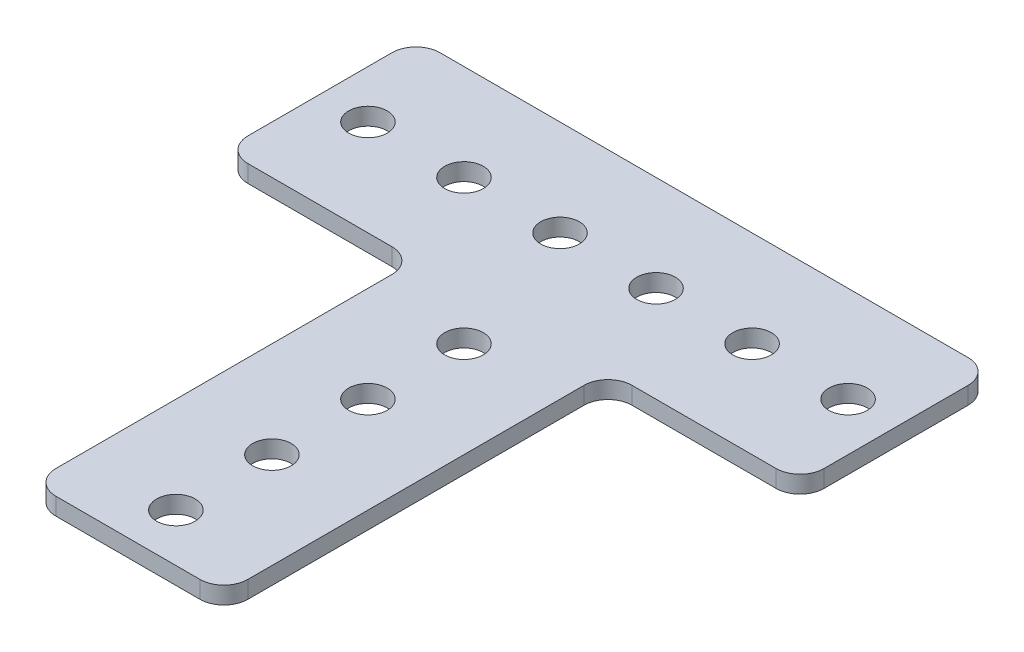
ISO-10303-21;
HEADER;
FILE_DESCRIPTION(('STEP AP214'),'2;1');
FILE_NAME('part.step','',(''),(''),'','','');
FILE_SCHEMA(('AUTOMOTIVE_DESIGN { 1 0 10303 214 1 1 1 1 }'));
ENDSEC;
DATA;
#1=APPLICATION_CONTEXT('core data for automotive mechanical design processes');
#2=APPLICATION_PROTOCOL_DEFINITION('international standard','automotive_design',2000,#1);
#3=PRODUCT_CONTEXT('',#1,'mechanical');
#4=PRODUCT('Part','Part','',(#3));
#5=PRODUCT_RELATED_PRODUCT_CATEGORY('part','',(#4));
#6=PRODUCT_DEFINITION_FORMATION('','',#4);
#7=PRODUCT_DEFINITION_CONTEXT('part definition',#1,'design');
#8=PRODUCT_DEFINITION('design','',#6,#7);
#9=PRODUCT_DEFINITION_SHAPE('','',#8);
#10=(LENGTH_UNIT() NAMED_UNIT(*) SI_UNIT(.MILLI.,.METRE.));
#11=(NAMED_UNIT(*) PLANE_ANGLE_UNIT() SI_UNIT($,.RADIAN.));
#12=(NAMED_UNIT(*) SI_UNIT($,.STERADIAN.) SOLID_ANGLE_UNIT());
#13=UNCERTAINTY_MEASURE_WITH_UNIT(LENGTH_MEASURE(1.E-05),#10,'distance_accuracy_value','');
#14=(GEOMETRIC_REPRESENTATION_CONTEXT(3) GLOBAL_UNCERTAINTY_ASSIGNED_CONTEXT((#13)) GLOBAL_UNIT_ASSIGNED_CONTEXT((#10,
#11,#12)) REPRESENTATION_CONTEXT('',''));
#15=CARTESIAN_POINT('',(0.,0.,0.));
#16=DIRECTION('',(0.,0.,1.));
#17=DIRECTION('',(1.,0.,0.));
#18=AXIS2_PLACEMENT_3D('',#15,#16,#17);
#19=CARTESIAN_POINT('',(38.1,1.143,-12.7));
#20=DIRECTION('',(-1.,0.,0.));
#21=DIRECTION('',(0.,0.,1.));
#22=AXIS2_PLACEMENT_3D('',#19,#20,#21);
#23=PLANE('',#22);
#24=DIRECTION('',(0.,0.,-1.));
#25=VECTOR('',#24,1.);
#26=CARTESIAN_POINT('',(38.1,1.143,-12.7));
#27=LINE('',#26,#25);
#28=CARTESIAN_POINT('',(38.1,1.143,9.525));
#29=VERTEX_POINT('',#28);
#30=CARTESIAN_POINT('',(38.1,1.143,-9.525));
#31=VERTEX_POINT('',#30);
#32=EDGE_CURVE('E166',#29,#31,#27,.T.);
#33=ORIENTED_EDGE('',*,*,#32,.F.);
#34=DIRECTION('',(0.,-1.,0.));
#35=VECTOR('',#34,1.);
#36=CARTESIAN_POINT('',(38.1,1.143,9.525));
#37=LINE('',#36,#35);
#38=CARTESIAN_POINT('',(38.1,-1.143,9.525));
#39=VERTEX_POINT('',#38);
#40=EDGE_CURVE('E151',#29,#39,#37,.T.);
#41=ORIENTED_EDGE('',*,*,#40,.T.);
#42=DIRECTION('',(0.,0.,-1.));
#43=VECTOR('',#42,1.);
#44=CARTESIAN_POINT('',(38.1,-1.143,-12.7));
#45=LINE('',#44,#43);
#46=CARTESIAN_POINT('',(38.1,-1.143,-9.525));
#47=VERTEX_POINT('',#46);
#48=EDGE_CURVE('E163',#39,#47,#45,.T.);
#49=ORIENTED_EDGE('',*,*,#48,.T.);
#50=DIRECTION('',(0.,-1.,0.));
#51=VECTOR('',#50,1.);
#52=CARTESIAN_POINT('',(38.1,1.143,-9.525));
#53=LINE('',#52,#51);
#54=EDGE_CURVE('E168',#47,#31,#53,.F.);
#55=ORIENTED_EDGE('',*,*,#54,.T.);
#56=EDGE_LOOP('',(#33,#41,#49,#55));
#57=FACE_BOUND('',#56,.T.);
#58=ADVANCED_FACE('F33',(#57),#23,.F.);
#59=CARTESIAN_POINT('',(-38.1,1.143,-12.7));
#60=DIRECTION('',(0.,0.,1.));
#61=DIRECTION('',(1.,0.,0.));
#62=AXIS2_PLACEMENT_3D('',#59,#60,#61);
#63=PLANE('',#62);
#64=DIRECTION('',(-1.,0.,0.));
#65=VECTOR('',#64,1.);
#66=CARTESIAN_POINT('',(-38.1,-1.143,-12.7));
#67=LINE('',#66,#65);
#68=CARTESIAN_POINT('',(34.925,-1.143,-12.7));
#69=VERTEX_POINT('',#68);
#70=CARTESIAN_POINT('',(-34.925,-1.143,-12.7));
#71=VERTEX_POINT('',#70);
#72=EDGE_CURVE('E173',#69,#71,#67,.T.);
#73=ORIENTED_EDGE('',*,*,#72,.T.);
#74=DIRECTION('',(0.,-1.,0.));
#75=VECTOR('',#74,1.);
#76=CARTESIAN_POINT('',(-34.925,1.143,-12.7));
#77=LINE('',#76,#75);
#78=CARTESIAN_POINT('',(-34.925,1.143,-12.7));
#79=VERTEX_POINT('',#78);
#80=EDGE_CURVE('E245',#71,#79,#77,.F.);
#81=ORIENTED_EDGE('',*,*,#80,.T.);
#82=DIRECTION('',(-1.,0.,0.));
#83=VECTOR('',#82,1.);
#84=CARTESIAN_POINT('',(-38.1,1.143,-12.7));
#85=LINE('',#84,#83);
#86=CARTESIAN_POINT('',(34.925,1.143,-12.7));
#87=VERTEX_POINT('',#86);
#88=EDGE_CURVE('E346',#87,#79,#85,.T.);
#89=ORIENTED_EDGE('',*,*,#88,.F.);
#90=DIRECTION('',(0.,-1.,0.));
#91=VECTOR('',#90,1.);
#92=CARTESIAN_POINT('',(34.925,1.143,-12.7));
#93=LINE('',#92,#91);
#94=EDGE_CURVE('E242',#87,#69,#93,.T.);
#95=ORIENTED_EDGE('',*,*,#94,.T.);
#96=EDGE_LOOP('',(#73,#81,#89,#95));
#97=FACE_BOUND('',#96,.T.);
#98=ADVANCED_FACE('F313',(#97),#63,.F.);
#99=CARTESIAN_POINT('',(-38.1,1.143,-12.7));
#100=DIRECTION('',(1.,0.,0.));
#101=DIRECTION('',(0.,0.,-1.));
#102=AXIS2_PLACEMENT_3D('',#99,#100,#101);
#103=PLANE('',#102);
#104=DIRECTION('',(0.,0.,1.));
#105=VECTOR('',#104,1.);
#106=CARTESIAN_POINT('',(-38.1,-1.143,-12.7));
#107=LINE('',#106,#105);
#108=CARTESIAN_POINT('',(-38.1,-1.143,-9.525));
#109=VERTEX_POINT('',#108);
#110=CARTESIAN_POINT('',(-38.1,-1.143,9.525));
#111=VERTEX_POINT('',#110);
#112=EDGE_CURVE('E177',#109,#111,#107,.T.);
#113=ORIENTED_EDGE('',*,*,#112,.T.);
#114=DIRECTION('',(0.,-1.,0.));
#115=VECTOR('',#114,1.);
#116=CARTESIAN_POINT('',(-38.1,1.143,9.525));
#117=LINE('',#116,#115);
#118=CARTESIAN_POINT('',(-38.1,1.143,9.525));
#119=VERTEX_POINT('',#118);
#120=EDGE_CURVE('E240',#111,#119,#117,.F.);
#121=ORIENTED_EDGE('',*,*,#120,.T.);
#122=DIRECTION('',(0.,0.,1.));
#123=VECTOR('',#122,1.);
#124=CARTESIAN_POINT('',(-38.1,1.143,-12.7));
#125=LINE('',#124,#123);
#126=CARTESIAN_POINT('',(-38.1,1.143,-9.525));
#127=VERTEX_POINT('',#126);
#128=EDGE_CURVE('E281',#127,#119,#125,.T.);
#129=ORIENTED_EDGE('',*,*,#128,.F.);
#130=DIRECTION('',(0.,-1.,0.));
#131=VECTOR('',#130,1.);
#132=CARTESIAN_POINT('',(-38.1,1.143,-9.525));
#133=LINE('',#132,#131);
#134=EDGE_CURVE('E237',#127,#109,#133,.T.);
#135=ORIENTED_EDGE('',*,*,#134,.T.);
#136=EDGE_LOOP('',(#113,#121,#129,#135));
#137=FACE_BOUND('',#136,.T.);
#138=ADVANCED_FACE('F318',(#137),#103,.F.);
#139=CARTESIAN_POINT('',(-38.1,1.143,12.7));
#140=DIRECTION('',(0.,0.,-1.));
#141=DIRECTION('',(-1.,0.,0.));
#142=AXIS2_PLACEMENT_3D('',#139,#140,#141);
#143=PLANE('',#142);
#144=DIRECTION('',(1.,0.,0.));
#145=VECTOR('',#144,1.);
#146=CARTESIAN_POINT('',(-38.1,-1.143,12.7));
#147=LINE('',#146,#145);
#148=CARTESIAN_POINT('',(-34.925,-1.143,12.7));
#149=VERTEX_POINT('',#148);
#150=CARTESIAN_POINT('',(-15.875,-1.143,12.7));
#151=VERTEX_POINT('',#150);
#152=EDGE_CURVE('E188',#149,#151,#147,.T.);
#153=ORIENTED_EDGE('',*,*,#152,.T.);
#154=DIRECTION('',(0.,-1.,0.));
#155=VECTOR('',#154,1.);
#156=CARTESIAN_POINT('',(-15.875,1.143,12.7));
#157=LINE('',#156,#155);
#158=CARTESIAN_POINT('',(-15.875,1.143,12.7));
#159=VERTEX_POINT('',#158);
#160=EDGE_CURVE('E235',#151,#159,#157,.F.);
#161=ORIENTED_EDGE('',*,*,#160,.T.);
#162=DIRECTION('',(1.,0.,0.));
#163=VECTOR('',#162,1.);
#164=CARTESIAN_POINT('',(-38.1,1.143,12.7));
#165=LINE('',#164,#163);
#166=CARTESIAN_POINT('',(-34.925,1.143,12.7));
#167=VERTEX_POINT('',#166);
#168=EDGE_CURVE('E273',#167,#159,#165,.T.);
#169=ORIENTED_EDGE('',*,*,#168,.F.);
#170=DIRECTION('',(0.,-1.,0.));
#171=VECTOR('',#170,1.);
#172=CARTESIAN_POINT('',(-34.925,1.143,12.7));
#173=LINE('',#172,#171);
#174=EDGE_CURVE('E232',#167,#149,#173,.T.);
#175=ORIENTED_EDGE('',*,*,#174,.T.);
#176=EDGE_LOOP('',(#153,#161,#169,#175));
#177=FACE_BOUND('',#176,.T.);
#178=ADVANCED_FACE('F261',(#177),#143,.F.);
#179=CARTESIAN_POINT('',(-12.7,1.143,12.7));
#180=DIRECTION('',(1.,0.,0.));
#181=DIRECTION('',(0.,0.,-1.));
#182=AXIS2_PLACEMENT_3D('',#179,#180,#181);
#183=PLANE('',#182);
#184=DIRECTION('',(0.,0.,1.));
#185=VECTOR('',#184,1.);
#186=CARTESIAN_POINT('',(-12.7,1.143,12.7));
#187=LINE('',#186,#185);
#188=CARTESIAN_POINT('',(-12.7,1.143,15.875));
#189=VERTEX_POINT('',#188);
#190=CARTESIAN_POINT('',(-12.7,1.143,60.325));
#191=VERTEX_POINT('',#190);
#192=EDGE_CURVE('E271',#189,#191,#187,.T.);
#193=ORIENTED_EDGE('',*,*,#192,.F.);
#194=DIRECTION('',(0.,-1.,0.));
#195=VECTOR('',#194,1.);
#196=CARTESIAN_POINT('',(-12.7,-1.143,15.875));
#197=LINE('',#196,#195);
#198=CARTESIAN_POINT('',(-12.7,-1.143,15.875));
#199=VERTEX_POINT('',#198);
#200=EDGE_CURVE('E229',#189,#199,#197,.T.);
#201=ORIENTED_EDGE('',*,*,#200,.T.);
#202=DIRECTION('',(0.,0.,1.));
#203=VECTOR('',#202,1.);
#204=CARTESIAN_POINT('',(-12.7,-1.143,12.7));
#205=LINE('',#204,#203);
#206=CARTESIAN_POINT('',(-12.7,-1.143,60.325));
#207=VERTEX_POINT('',#206);
#208=EDGE_CURVE('E191',#199,#207,#205,.T.);
#209=ORIENTED_EDGE('',*,*,#208,.T.);
#210=DIRECTION('',(0.,-1.,0.));
#211=VECTOR('',#210,1.);
#212=CARTESIAN_POINT('',(-12.7,1.143,60.325));
#213=LINE('',#212,#211);
#214=EDGE_CURVE('E227',#207,#191,#213,.F.);
#215=ORIENTED_EDGE('',*,*,#214,.T.);
#216=EDGE_LOOP('',(#193,#201,#209,#215));
#217=FACE_BOUND('',#216,.T.);
#218=ADVANCED_FACE('F275',(#217),#183,.F.);
#219=CARTESIAN_POINT('',(-12.7,1.143,63.5));
#220=DIRECTION('',(0.,0.,-1.));
#221=DIRECTION('',(-1.,0.,0.));
#222=AXIS2_PLACEMENT_3D('',#219,#220,#221);
#223=PLANE('',#222);
#224=DIRECTION('',(1.,0.,0.));
#225=VECTOR('',#224,1.);
#226=CARTESIAN_POINT('',(-12.7,1.143,63.5));
#227=LINE('',#226,#225);
#228=CARTESIAN_POINT('',(-9.525,1.143,63.5));
#229=VERTEX_POINT('',#228);
#230=CARTESIAN_POINT('',(9.525,1.143,63.5));
#231=VERTEX_POINT('',#230);
#232=EDGE_CURVE('E277',#229,#231,#227,.T.);
#233=ORIENTED_EDGE('',*,*,#232,.F.);
#234=DIRECTION('',(0.,-1.,0.));
#235=VECTOR('',#234,1.);
#236=CARTESIAN_POINT('',(-9.525,1.143,63.5));
#237=LINE('',#236,#235);
#238=CARTESIAN_POINT('',(-9.525,-1.143,63.5));
#239=VERTEX_POINT('',#238);
#240=EDGE_CURVE('E249',#229,#239,#237,.T.);
#241=ORIENTED_EDGE('',*,*,#240,.T.);
#242=DIRECTION('',(1.,0.,0.));
#243=VECTOR('',#242,1.);
#244=CARTESIAN_POINT('',(-12.7,-1.143,63.5));
#245=LINE('',#244,#243);
#246=CARTESIAN_POINT('',(9.525,-1.143,63.5));
#247=VERTEX_POINT('',#246);
#248=EDGE_CURVE('E194',#239,#247,#245,.T.);
#249=ORIENTED_EDGE('',*,*,#248,.T.);
#250=DIRECTION('',(0.,-1.,0.));
#251=VECTOR('',#250,1.);
#252=CARTESIAN_POINT('',(9.525,1.143,63.5));
#253=LINE('',#252,#251);
#254=EDGE_CURVE('E247',#247,#231,#253,.F.);
#255=ORIENTED_EDGE('',*,*,#254,.T.);
#256=EDGE_LOOP('',(#233,#241,#249,#255));
#257=FACE_BOUND('',#256,.T.);
#258=ADVANCED_FACE('F299',(#257),#223,.F.);
#259=CARTESIAN_POINT('',(12.7,1.143,12.7));
#260=DIRECTION('',(-1.,0.,0.));
#261=DIRECTION('',(0.,0.,1.));
#262=AXIS2_PLACEMENT_3D('',#259,#260,#261);
#263=PLANE('',#262);
#264=DIRECTION('',(0.,0.,-1.));
#265=VECTOR('',#264,1.);
#266=CARTESIAN_POINT('',(12.7,-1.143,12.7));
#267=LINE('',#266,#265);
#268=CARTESIAN_POINT('',(12.7,-1.143,60.325));
#269=VERTEX_POINT('',#268);
#270=CARTESIAN_POINT('',(12.7,-1.143,15.875));
#271=VERTEX_POINT('',#270);
#272=EDGE_CURVE('E197',#269,#271,#267,.T.);
#273=ORIENTED_EDGE('',*,*,#272,.T.);
#274=DIRECTION('',(0.,-1.,0.));
#275=VECTOR('',#274,1.);
#276=CARTESIAN_POINT('',(12.7,1.143,15.875));
#277=LINE('',#276,#275);
#278=CARTESIAN_POINT('',(12.7,1.143,15.875));
#279=VERTEX_POINT('',#278);
#280=EDGE_CURVE('E48',#271,#279,#277,.F.);
#281=ORIENTED_EDGE('',*,*,#280,.T.);
#282=DIRECTION('',(0.,0.,-1.));
#283=VECTOR('',#282,1.);
#284=CARTESIAN_POINT('',(12.7,1.143,12.7));
#285=LINE('',#284,#283);
#286=CARTESIAN_POINT('',(12.7,1.143,60.325));
#287=VERTEX_POINT('',#286);
#288=EDGE_CURVE('E279',#287,#279,#285,.T.);
#289=ORIENTED_EDGE('',*,*,#288,.F.);
#290=DIRECTION('',(0.,-1.,0.));
#291=VECTOR('',#290,1.);
#292=CARTESIAN_POINT('',(12.7,1.143,60.325));
#293=LINE('',#292,#291);
#294=EDGE_CURVE('E223',#287,#269,#293,.T.);
#295=ORIENTED_EDGE('',*,*,#294,.T.);
#296=EDGE_LOOP('',(#273,#281,#289,#295));
#297=FACE_BOUND('',#296,.T.);
#298=ADVANCED_FACE('F292',(#297),#263,.F.);
#299=CARTESIAN_POINT('',(12.7,1.143,12.7));
#300=DIRECTION('',(0.,0.,-1.));
#301=DIRECTION('',(-1.,0.,0.));
#302=AXIS2_PLACEMENT_3D('',#299,#300,#301);
#303=PLANE('',#302);
#304=DIRECTION('',(1.,0.,0.));
#305=VECTOR('',#304,1.);
#306=CARTESIAN_POINT('',(12.7,-1.143,12.7));
#307=LINE('',#306,#305);
#308=CARTESIAN_POINT('',(15.875,-1.143,12.7));
#309=VERTEX_POINT('',#308);
#310=CARTESIAN_POINT('',(34.925,-1.143,12.7));
#311=VERTEX_POINT('',#310);
#312=EDGE_CURVE('E199',#309,#311,#307,.T.);
#313=ORIENTED_EDGE('',*,*,#312,.T.);
#314=DIRECTION('',(0.,-1.,0.));
#315=VECTOR('',#314,1.);
#316=CARTESIAN_POINT('',(34.925,1.143,12.7));
#317=LINE('',#316,#315);
#318=CARTESIAN_POINT('',(34.925,1.143,12.7));
#319=VERTEX_POINT('',#318);
#320=EDGE_CURVE('E152',#311,#319,#317,.F.);
#321=ORIENTED_EDGE('',*,*,#320,.T.);
#322=DIRECTION('',(1.,0.,0.));
#323=VECTOR('',#322,1.);
#324=CARTESIAN_POINT('',(12.7,1.143,12.7));
#325=LINE('',#324,#323);
#326=CARTESIAN_POINT('',(15.875,1.143,12.7));
#327=VERTEX_POINT('',#326);
#328=EDGE_CURVE('E183',#327,#319,#325,.T.);
#329=ORIENTED_EDGE('',*,*,#328,.F.);
#330=DIRECTION('',(0.,-1.,0.));
#331=VECTOR('',#330,1.);
#332=CARTESIAN_POINT('',(15.875,-1.143,12.7));
#333=LINE('',#332,#331);
#334=EDGE_CURVE('E157',#327,#309,#333,.T.);
#335=ORIENTED_EDGE('',*,*,#334,.T.);
#336=EDGE_LOOP('',(#313,#321,#329,#335));
#337=FACE_BOUND('',#336,.T.);
#338=ADVANCED_FACE('F288',(#337),#303,.F.);
#339=CARTESIAN_POINT('',(0.,1.143,0.));
#340=DIRECTION('',(0.,1.,0.));
#341=DIRECTION('',(0.,0.,1.));
#342=AXIS2_PLACEMENT_3D('',#339,#340,#341);
#343=PLANE('',#342);
#344=CARTESIAN_POINT('',(-1.26086545106016E-13,1.143,19.05));
#345=DIRECTION('',(0.,1.,0.));
#346=DIRECTION('',(0.,0.,1.));
#347=AXIS2_PLACEMENT_3D('',#344,#345,#346);
#348=CIRCLE('',#347,2.5527);
#349=CARTESIAN_POINT('',(-1.26086545106016E-13,1.143,21.6027));
#350=VERTEX_POINT('',#349);
#351=EDGE_CURVE('E404',#350,#350,#348,.T.);
#352=ORIENTED_EDGE('',*,*,#351,.F.);
#353=EDGE_LOOP('',(#352));
#354=FACE_BOUND('',#353,.T.);
#355=CARTESIAN_POINT('',(0.,1.143,31.75));
#356=DIRECTION('',(0.,1.,0.));
#357=DIRECTION('',(0.,0.,1.));
#358=AXIS2_PLACEMENT_3D('',#355,#356,#357);
#359=CIRCLE('',#358,2.5527);
#360=CARTESIAN_POINT('',(0.,1.143,34.3027));
#361=VERTEX_POINT('',#360);
#362=EDGE_CURVE('E398',#361,#361,#359,.T.);
#363=ORIENTED_EDGE('',*,*,#362,.F.);
#364=EDGE_LOOP('',(#363));
#365=FACE_BOUND('',#364,.T.);
#366=CARTESIAN_POINT('',(31.75,1.143,0.));
#367=DIRECTION('',(0.,1.,0.));
#368=DIRECTION('',(0.,0.,1.));
#369=AXIS2_PLACEMENT_3D('',#366,#367,#368);
#370=CIRCLE('',#369,2.5527);
#371=CARTESIAN_POINT('',(31.75,1.143,2.5527));
#372=VERTEX_POINT('',#371);
#373=EDGE_CURVE('E392',#372,#372,#370,.T.);
#374=ORIENTED_EDGE('',*,*,#373,.F.);
#375=EDGE_LOOP('',(#374));
#376=FACE_BOUND('',#375,.T.);
#377=CARTESIAN_POINT('',(19.05,1.143,0.));
#378=DIRECTION('',(0.,1.,0.));
#379=DIRECTION('',(0.,0.,1.));
#380=AXIS2_PLACEMENT_3D('',#377,#378,#379);
#381=CIRCLE('',#380,2.5527);
#382=CARTESIAN_POINT('',(19.05,1.143,2.5527));
#383=VERTEX_POINT('',#382);
#384=EDGE_CURVE('E386',#383,#383,#381,.T.);
#385=ORIENTED_EDGE('',*,*,#384,.F.);
#386=EDGE_LOOP('',(#385));
#387=FACE_BOUND('',#386,.T.);
#388=CARTESIAN_POINT('',(6.35,1.143,0.));
#389=DIRECTION('',(0.,1.,0.));
#390=DIRECTION('',(0.,0.,1.));
#391=AXIS2_PLACEMENT_3D('',#388,#389,#390);
#392=CIRCLE('',#391,2.5527);
#393=CARTESIAN_POINT('',(6.35,1.143,2.5527));
#394=VERTEX_POINT('',#393);
#395=EDGE_CURVE('E380',#394,#394,#392,.T.);
#396=ORIENTED_EDGE('',*,*,#395,.F.);
#397=EDGE_LOOP('',(#396));
#398=FACE_BOUND('',#397,.T.);
#399=CARTESIAN_POINT('',(-6.34999999999999,1.143,0.));
#400=DIRECTION('',(0.,1.,0.));
#401=DIRECTION('',(0.,0.,1.));
#402=AXIS2_PLACEMENT_3D('',#399,#400,#401);
#403=CIRCLE('',#402,2.5527);
#404=CARTESIAN_POINT('',(-6.34999999999999,1.143,2.5527));
#405=VERTEX_POINT('',#404);
#406=EDGE_CURVE('E374',#405,#405,#403,.T.);
#407=ORIENTED_EDGE('',*,*,#406,.F.);
#408=EDGE_LOOP('',(#407));
#409=FACE_BOUND('',#408,.T.);
#410=CARTESIAN_POINT('',(-19.05,1.143,0.));
#411=DIRECTION('',(0.,1.,0.));
#412=DIRECTION('',(0.,0.,1.));
#413=AXIS2_PLACEMENT_3D('',#410,#411,#412);
#414=CIRCLE('',#413,2.5527);
#415=CARTESIAN_POINT('',(-19.05,1.143,2.5527));
#416=VERTEX_POINT('',#415);
#417=EDGE_CURVE('E368',#416,#416,#414,.T.);
#418=ORIENTED_EDGE('',*,*,#417,.F.);
#419=EDGE_LOOP('',(#418));
#420=FACE_BOUND('',#419,.T.);
#421=CARTESIAN_POINT('',(0.,1.143,44.45));
#422=DIRECTION('',(0.,1.,0.));
#423=DIRECTION('',(0.,0.,1.));
#424=AXIS2_PLACEMENT_3D('',#421,#422,#423);
#425=CIRCLE('',#424,2.5527);
#426=CARTESIAN_POINT('',(0.,1.143,47.0027));
#427=VERTEX_POINT('',#426);
#428=EDGE_CURVE('E362',#427,#427,#425,.T.);
#429=ORIENTED_EDGE('',*,*,#428,.F.);
#430=EDGE_LOOP('',(#429));
#431=FACE_BOUND('',#430,.T.);
#432=CARTESIAN_POINT('',(0.,1.143,57.15));
#433=DIRECTION('',(0.,1.,0.));
#434=DIRECTION('',(0.,0.,1.));
#435=AXIS2_PLACEMENT_3D('',#432,#433,#434);
#436=CIRCLE('',#435,2.5527);
#437=CARTESIAN_POINT('',(0.,1.143,59.7027));
#438=VERTEX_POINT('',#437);
#439=EDGE_CURVE('E356',#438,#438,#436,.T.);
#440=ORIENTED_EDGE('',*,*,#439,.F.);
#441=EDGE_LOOP('',(#440));
#442=FACE_BOUND('',#441,.T.);
#443=CARTESIAN_POINT('',(-31.75,1.143,0.));
#444=DIRECTION('',(0.,1.,0.));
#445=DIRECTION('',(0.,0.,1.));
#446=AXIS2_PLACEMENT_3D('',#443,#444,#445);
#447=CIRCLE('',#446,2.5527);
#448=CARTESIAN_POINT('',(-31.75,1.143,2.5527));
#449=VERTEX_POINT('',#448);
#450=EDGE_CURVE('E180',#449,#449,#447,.T.);
#451=ORIENTED_EDGE('',*,*,#450,.F.);
#452=EDGE_LOOP('',(#451));
#453=FACE_BOUND('',#452,.T.);
#454=ORIENTED_EDGE('',*,*,#328,.T.);
#455=CARTESIAN_POINT('',(34.925,1.143,9.525));
#456=DIRECTION('',(0.,1.,0.));
#457=DIRECTION('',(0.,0.,1.));
#458=AXIS2_PLACEMENT_3D('',#455,#456,#457);
#459=CIRCLE('',#458,3.175);
#460=EDGE_CURVE('E221',#319,#29,#459,.T.);
#461=ORIENTED_EDGE('',*,*,#460,.T.);
#462=ORIENTED_EDGE('',*,*,#32,.T.);
#463=CARTESIAN_POINT('',(34.925,1.143,-9.525));
#464=DIRECTION('',(0.,1.,0.));
#465=DIRECTION('',(0.,0.,1.));
#466=AXIS2_PLACEMENT_3D('',#463,#464,#465);
#467=CIRCLE('',#466,3.175);
#468=EDGE_CURVE('E215',#31,#87,#467,.T.);
#469=ORIENTED_EDGE('',*,*,#468,.T.);
#470=ORIENTED_EDGE('',*,*,#88,.T.);
#471=CARTESIAN_POINT('',(-34.925,1.143,-9.525));
#472=DIRECTION('',(0.,1.,0.));
#473=DIRECTION('',(0.,0.,1.));
#474=AXIS2_PLACEMENT_3D('',#471,#472,#473);
#475=CIRCLE('',#474,3.175);
#476=EDGE_CURVE('E217',#79,#127,#475,.T.);
#477=ORIENTED_EDGE('',*,*,#476,.T.);
#478=ORIENTED_EDGE('',*,*,#128,.T.);
#479=CARTESIAN_POINT('',(-34.925,1.143,9.525));
#480=DIRECTION('',(0.,1.,0.));
#481=DIRECTION('',(0.,0.,1.));
#482=AXIS2_PLACEMENT_3D('',#479,#480,#481);
#483=CIRCLE('',#482,3.175);
#484=EDGE_CURVE('E219',#119,#167,#483,.T.);
#485=ORIENTED_EDGE('',*,*,#484,.T.);
#486=ORIENTED_EDGE('',*,*,#168,.T.);
#487=CARTESIAN_POINT('',(-15.875,1.143,15.875));
#488=DIRECTION('',(0.,1.,0.));
#489=DIRECTION('',(0.,0.,1.));
#490=AXIS2_PLACEMENT_3D('',#487,#488,#489);
#491=CIRCLE('',#490,3.175);
#492=EDGE_CURVE('E11',#159,#189,#491,.F.);
#493=ORIENTED_EDGE('',*,*,#492,.T.);
#494=ORIENTED_EDGE('',*,*,#192,.T.);
#495=CARTESIAN_POINT('',(-9.525,1.143,60.325));
#496=DIRECTION('',(0.,1.,0.));
#497=DIRECTION('',(0.,0.,1.));
#498=AXIS2_PLACEMENT_3D('',#495,#496,#497);
#499=CIRCLE('',#498,3.175);
#500=EDGE_CURVE('E213',#191,#229,#499,.T.);
#501=ORIENTED_EDGE('',*,*,#500,.T.);
#502=ORIENTED_EDGE('',*,*,#232,.T.);
#503=CARTESIAN_POINT('',(9.525,1.143,60.325));
#504=DIRECTION('',(0.,1.,0.));
#505=DIRECTION('',(0.,0.,1.));
#506=AXIS2_PLACEMENT_3D('',#503,#504,#505);
#507=CIRCLE('',#506,3.175);
#508=EDGE_CURVE('E55',#231,#287,#507,.T.);
#509=ORIENTED_EDGE('',*,*,#508,.T.);
#510=ORIENTED_EDGE('',*,*,#288,.T.);
#511=CARTESIAN_POINT('',(15.875,1.143,15.875));
#512=DIRECTION('',(0.,1.,0.));
#513=DIRECTION('',(0.,0.,1.));
#514=AXIS2_PLACEMENT_3D('',#511,#512,#513);
#515=CIRCLE('',#514,3.175);
#516=EDGE_CURVE('E254',#279,#327,#515,.F.);
#517=ORIENTED_EDGE('',*,*,#516,.T.);
#518=EDGE_LOOP('',(#454,#461,#462,#469,#470,#477,#478,#485,#486,#493,#494,#501,#502,#509,#510,#517));
#519=FACE_BOUND('',#518,.T.);
#520=ADVANCED_FACE('F270',(#354,#365,#376,#387,#398,#409,#420,#431,#442,#453,#519),#343,.T.);
#521=CARTESIAN_POINT('',(0.,-1.143,0.));
#522=DIRECTION('',(0.,1.,0.));
#523=DIRECTION('',(0.,0.,1.));
#524=AXIS2_PLACEMENT_3D('',#521,#522,#523);
#525=PLANE('',#524);
#526=CARTESIAN_POINT('',(-1.26086545106016E-13,-1.143,19.05));
#527=DIRECTION('',(0.,1.,0.));
#528=DIRECTION('',(0.,0.,1.));
#529=AXIS2_PLACEMENT_3D('',#526,#527,#528);
#530=CIRCLE('',#529,2.5527);
#531=CARTESIAN_POINT('',(-1.26086545106016E-13,-1.143,21.6027));
#532=VERTEX_POINT('',#531);
#533=EDGE_CURVE('E401',#532,#532,#530,.T.);
#534=ORIENTED_EDGE('',*,*,#533,.T.);
#535=EDGE_LOOP('',(#534));
#536=FACE_BOUND('',#535,.T.);
#537=CARTESIAN_POINT('',(0.,-1.143,31.75));
#538=DIRECTION('',(0.,1.,0.));
#539=DIRECTION('',(0.,0.,1.));
#540=AXIS2_PLACEMENT_3D('',#537,#538,#539);
#541=CIRCLE('',#540,2.5527);
#542=CARTESIAN_POINT('',(0.,-1.143,34.3027));
#543=VERTEX_POINT('',#542);
#544=EDGE_CURVE('E395',#543,#543,#541,.T.);
#545=ORIENTED_EDGE('',*,*,#544,.T.);
#546=EDGE_LOOP('',(#545));
#547=FACE_BOUND('',#546,.T.);
#548=CARTESIAN_POINT('',(31.75,-1.143,0.));
#549=DIRECTION('',(0.,1.,0.));
#550=DIRECTION('',(0.,0.,1.));
#551=AXIS2_PLACEMENT_3D('',#548,#549,#550);
#552=CIRCLE('',#551,2.5527);
#553=CARTESIAN_POINT('',(31.75,-1.143,2.5527));
#554=VERTEX_POINT('',#553);
#555=EDGE_CURVE('E389',#554,#554,#552,.T.);
#556=ORIENTED_EDGE('',*,*,#555,.T.);
#557=EDGE_LOOP('',(#556));
#558=FACE_BOUND('',#557,.T.);
#559=CARTESIAN_POINT('',(19.05,-1.143,0.));
#560=DIRECTION('',(0.,1.,0.));
#561=DIRECTION('',(0.,0.,1.));
#562=AXIS2_PLACEMENT_3D('',#559,#560,#561);
#563=CIRCLE('',#562,2.5527);
#564=CARTESIAN_POINT('',(19.05,-1.143,2.5527));
#565=VERTEX_POINT('',#564);
#566=EDGE_CURVE('E383',#565,#565,#563,.T.);
#567=ORIENTED_EDGE('',*,*,#566,.T.);
#568=EDGE_LOOP('',(#567));
#569=FACE_BOUND('',#568,.T.);
#570=CARTESIAN_POINT('',(6.35,-1.143,0.));
#571=DIRECTION('',(0.,1.,0.));
#572=DIRECTION('',(0.,0.,1.));
#573=AXIS2_PLACEMENT_3D('',#570,#571,#572);
#574=CIRCLE('',#573,2.5527);
#575=CARTESIAN_POINT('',(6.35,-1.143,2.5527));
#576=VERTEX_POINT('',#575);
#577=EDGE_CURVE('E377',#576,#576,#574,.T.);
#578=ORIENTED_EDGE('',*,*,#577,.T.);
#579=EDGE_LOOP('',(#578));
#580=FACE_BOUND('',#579,.T.);
#581=CARTESIAN_POINT('',(-6.34999999999999,-1.143,0.));
#582=DIRECTION('',(0.,1.,0.));
#583=DIRECTION('',(0.,0.,1.));
#584=AXIS2_PLACEMENT_3D('',#581,#582,#583);
#585=CIRCLE('',#584,2.5527);
#586=CARTESIAN_POINT('',(-6.34999999999999,-1.143,2.5527));
#587=VERTEX_POINT('',#586);
#588=EDGE_CURVE('E371',#587,#587,#585,.T.);
#589=ORIENTED_EDGE('',*,*,#588,.T.);
#590=EDGE_LOOP('',(#589));
#591=FACE_BOUND('',#590,.T.);
#592=CARTESIAN_POINT('',(-19.05,-1.143,0.));
#593=DIRECTION('',(0.,1.,0.));
#594=DIRECTION('',(0.,0.,1.));
#595=AXIS2_PLACEMENT_3D('',#592,#593,#594);
#596=CIRCLE('',#595,2.5527);
#597=CARTESIAN_POINT('',(-19.05,-1.143,2.5527));
#598=VERTEX_POINT('',#597);
#599=EDGE_CURVE('E365',#598,#598,#596,.T.);
#600=ORIENTED_EDGE('',*,*,#599,.T.);
#601=EDGE_LOOP('',(#600));
#602=FACE_BOUND('',#601,.T.);
#603=CARTESIAN_POINT('',(0.,-1.143,44.45));
#604=DIRECTION('',(0.,1.,0.));
#605=DIRECTION('',(0.,0.,1.));
#606=AXIS2_PLACEMENT_3D('',#603,#604,#605);
#607=CIRCLE('',#606,2.5527);
#608=CARTESIAN_POINT('',(0.,-1.143,47.0027));
#609=VERTEX_POINT('',#608);
#610=EDGE_CURVE('E359',#609,#609,#607,.T.);
#611=ORIENTED_EDGE('',*,*,#610,.T.);
#612=EDGE_LOOP('',(#611));
#613=FACE_BOUND('',#612,.T.);
#614=CARTESIAN_POINT('',(0.,-1.143,57.15));
#615=DIRECTION('',(0.,1.,0.));
#616=DIRECTION('',(0.,0.,1.));
#617=AXIS2_PLACEMENT_3D('',#614,#615,#616);
#618=CIRCLE('',#617,2.5527);
#619=CARTESIAN_POINT('',(0.,-1.143,59.7027));
#620=VERTEX_POINT('',#619);
#621=EDGE_CURVE('E354',#620,#620,#618,.T.);
#622=ORIENTED_EDGE('',*,*,#621,.T.);
#623=EDGE_LOOP('',(#622));
#624=FACE_BOUND('',#623,.T.);
#625=CARTESIAN_POINT('',(-31.75,-1.143,0.));
#626=DIRECTION('',(0.,1.,0.));
#627=DIRECTION('',(0.,0.,1.));
#628=AXIS2_PLACEMENT_3D('',#625,#626,#627);
#629=CIRCLE('',#628,2.5527);
#630=CARTESIAN_POINT('',(-31.75,-1.143,2.5527));
#631=VERTEX_POINT('',#630);
#632=EDGE_CURVE('E174',#631,#631,#629,.T.);
#633=ORIENTED_EDGE('',*,*,#632,.T.);
#634=EDGE_LOOP('',(#633));
#635=FACE_BOUND('',#634,.T.);
#636=ORIENTED_EDGE('',*,*,#48,.F.);
#637=CARTESIAN_POINT('',(34.925,-1.143,9.525));
#638=DIRECTION('',(0.,1.,0.));
#639=DIRECTION('',(0.,0.,1.));
#640=AXIS2_PLACEMENT_3D('',#637,#638,#639);
#641=CIRCLE('',#640,3.175);
#642=EDGE_CURVE('E147',#39,#311,#641,.F.);
#643=ORIENTED_EDGE('',*,*,#642,.T.);
#644=ORIENTED_EDGE('',*,*,#312,.F.);
#645=CARTESIAN_POINT('',(15.875,-1.143,15.875));
#646=DIRECTION('',(0.,1.,0.));
#647=DIRECTION('',(0.,0.,1.));
#648=AXIS2_PLACEMENT_3D('',#645,#646,#647);
#649=CIRCLE('',#648,3.175);
#650=EDGE_CURVE('E252',#309,#271,#649,.T.);
#651=ORIENTED_EDGE('',*,*,#650,.T.);
#652=ORIENTED_EDGE('',*,*,#272,.F.);
#653=CARTESIAN_POINT('',(9.525,-1.143,60.325));
#654=DIRECTION('',(0.,1.,0.));
#655=DIRECTION('',(0.,0.,1.));
#656=AXIS2_PLACEMENT_3D('',#653,#654,#655);
#657=CIRCLE('',#656,3.175);
#658=EDGE_CURVE('E167',#269,#247,#657,.F.);
#659=ORIENTED_EDGE('',*,*,#658,.T.);
#660=ORIENTED_EDGE('',*,*,#248,.F.);
#661=CARTESIAN_POINT('',(-9.525,-1.143,60.325));
#662=DIRECTION('',(0.,1.,0.));
#663=DIRECTION('',(0.,0.,1.));
#664=AXIS2_PLACEMENT_3D('',#661,#662,#663);
#665=CIRCLE('',#664,3.175);
#666=EDGE_CURVE('E203',#239,#207,#665,.F.);
#667=ORIENTED_EDGE('',*,*,#666,.T.);
#668=ORIENTED_EDGE('',*,*,#208,.F.);
#669=CARTESIAN_POINT('',(-15.875,-1.143,15.875));
#670=DIRECTION('',(0.,1.,0.));
#671=DIRECTION('',(0.,0.,1.));
#672=AXIS2_PLACEMENT_3D('',#669,#670,#671);
#673=CIRCLE('',#672,3.175);
#674=EDGE_CURVE('E41',#199,#151,#673,.T.);
#675=ORIENTED_EDGE('',*,*,#674,.T.);
#676=ORIENTED_EDGE('',*,*,#152,.F.);
#677=CARTESIAN_POINT('',(-34.925,-1.143,9.525));
#678=DIRECTION('',(0.,1.,0.));
#679=DIRECTION('',(0.,0.,1.));
#680=AXIS2_PLACEMENT_3D('',#677,#678,#679);
#681=CIRCLE('',#680,3.175);
#682=EDGE_CURVE('E158',#149,#111,#681,.F.);
#683=ORIENTED_EDGE('',*,*,#682,.T.);
#684=ORIENTED_EDGE('',*,*,#112,.F.);
#685=CARTESIAN_POINT('',(-34.925,-1.143,-9.525));
#686=DIRECTION('',(0.,1.,0.));
#687=DIRECTION('',(0.,0.,1.));
#688=AXIS2_PLACEMENT_3D('',#685,#686,#687);
#689=CIRCLE('',#688,3.175);
#690=EDGE_CURVE('E206',#109,#71,#689,.F.);
#691=ORIENTED_EDGE('',*,*,#690,.T.);
#692=ORIENTED_EDGE('',*,*,#72,.F.);
#693=CARTESIAN_POINT('',(34.925,-1.143,-9.525));
#694=DIRECTION('',(0.,1.,0.));
#695=DIRECTION('',(0.,0.,1.));
#696=AXIS2_PLACEMENT_3D('',#693,#694,#695);
#697=CIRCLE('',#696,3.175);
#698=EDGE_CURVE('E172',#69,#47,#697,.F.);
#699=ORIENTED_EDGE('',*,*,#698,.T.);
#700=EDGE_LOOP('',(#636,#643,#644,#651,#652,#659,#660,#667,#668,#675,#676,#683,#684,#691,#692,#699));
#701=FACE_BOUND('',#700,.T.);
#702=ADVANCED_FACE('F170',(#536,#547,#558,#569,#580,#591,#602,#613,#624,#635,#701),#525,.F.);
#703=CARTESIAN_POINT('',(-31.75,-1.143,0.));
#704=DIRECTION('',(0.,1.,0.));
#705=DIRECTION('',(0.,0.,1.));
#706=AXIS2_PLACEMENT_3D('',#703,#704,#705);
#707=CYLINDRICAL_SURFACE('',#706,2.5527);
#708=ORIENTED_EDGE('',*,*,#632,.F.);
#709=EDGE_LOOP('',(#708));
#710=FACE_BOUND('',#709,.T.);
#711=ORIENTED_EDGE('',*,*,#450,.T.);
#712=EDGE_LOOP('',(#711));
#713=FACE_BOUND('',#712,.T.);
#714=ADVANCED_FACE('F439',(#710,#713),#707,.F.);
#715=CARTESIAN_POINT('',(0.,-1.143,57.15));
#716=DIRECTION('',(0.,1.,0.));
#717=DIRECTION('',(0.,0.,1.));
#718=AXIS2_PLACEMENT_3D('',#715,#716,#717);
#719=CYLINDRICAL_SURFACE('',#718,2.5527);
#720=ORIENTED_EDGE('',*,*,#621,.F.);
#721=EDGE_LOOP('',(#720));
#722=FACE_BOUND('',#721,.T.);
#723=ORIENTED_EDGE('',*,*,#439,.T.);
#724=EDGE_LOOP('',(#723));
#725=FACE_BOUND('',#724,.T.);
#726=ADVANCED_FACE('F441',(#722,#725),#719,.F.);
#727=CARTESIAN_POINT('',(0.,-1.143,44.45));
#728=DIRECTION('',(0.,1.,0.));
#729=DIRECTION('',(0.,0.,1.));
#730=AXIS2_PLACEMENT_3D('',#727,#728,#729);
#731=CYLINDRICAL_SURFACE('',#730,2.5527);
#732=ORIENTED_EDGE('',*,*,#610,.F.);
#733=EDGE_LOOP('',(#732));
#734=FACE_BOUND('',#733,.T.);
#735=ORIENTED_EDGE('',*,*,#428,.T.);
#736=EDGE_LOOP('',(#735));
#737=FACE_BOUND('',#736,.T.);
#738=ADVANCED_FACE('F448',(#734,#737),#731,.F.);
#739=CARTESIAN_POINT('',(-19.05,-1.143,0.));
#740=DIRECTION('',(0.,1.,0.));
#741=DIRECTION('',(0.,0.,1.));
#742=AXIS2_PLACEMENT_3D('',#739,#740,#741);
#743=CYLINDRICAL_SURFACE('',#742,2.5527);
#744=ORIENTED_EDGE('',*,*,#599,.F.);
#745=EDGE_LOOP('',(#744));
#746=FACE_BOUND('',#745,.T.);
#747=ORIENTED_EDGE('',*,*,#417,.T.);
#748=EDGE_LOOP('',(#747));
#749=FACE_BOUND('',#748,.T.);
#750=ADVANCED_FACE('F586',(#746,#749),#743,.F.);
#751=CARTESIAN_POINT('',(-6.34999999999999,-1.143,0.));
#752=DIRECTION('',(0.,1.,0.));
#753=DIRECTION('',(0.,0.,1.));
#754=AXIS2_PLACEMENT_3D('',#751,#752,#753);
#755=CYLINDRICAL_SURFACE('',#754,2.5527);
#756=ORIENTED_EDGE('',*,*,#588,.F.);
#757=EDGE_LOOP('',(#756));
#758=FACE_BOUND('',#757,.T.);
#759=ORIENTED_EDGE('',*,*,#406,.T.);
#760=EDGE_LOOP('',(#759));
#761=FACE_BOUND('',#760,.T.);
#762=ADVANCED_FACE('F578',(#758,#761),#755,.F.);
#763=CARTESIAN_POINT('',(6.35,-1.143,0.));
#764=DIRECTION('',(0.,1.,0.));
#765=DIRECTION('',(0.,0.,1.));
#766=AXIS2_PLACEMENT_3D('',#763,#764,#765);
#767=CYLINDRICAL_SURFACE('',#766,2.5527);
#768=ORIENTED_EDGE('',*,*,#577,.F.);
#769=EDGE_LOOP('',(#768));
#770=FACE_BOUND('',#769,.T.);
#771=ORIENTED_EDGE('',*,*,#395,.T.);
#772=EDGE_LOOP('',(#771));
#773=FACE_BOUND('',#772,.T.);
#774=ADVANCED_FACE('F570',(#770,#773),#767,.F.);
#775=CARTESIAN_POINT('',(19.05,-1.143,0.));
#776=DIRECTION('',(0.,1.,0.));
#777=DIRECTION('',(0.,0.,1.));
#778=AXIS2_PLACEMENT_3D('',#775,#776,#777);
#779=CYLINDRICAL_SURFACE('',#778,2.5527);
#780=ORIENTED_EDGE('',*,*,#566,.F.);
#781=EDGE_LOOP('',(#780));
#782=FACE_BOUND('',#781,.T.);
#783=ORIENTED_EDGE('',*,*,#384,.T.);
#784=EDGE_LOOP('',(#783));
#785=FACE_BOUND('',#784,.T.);
#786=ADVANCED_FACE('F562',(#782,#785),#779,.F.);
#787=CARTESIAN_POINT('',(31.75,-1.143,0.));
#788=DIRECTION('',(0.,1.,0.));
#789=DIRECTION('',(0.,0.,1.));
#790=AXIS2_PLACEMENT_3D('',#787,#788,#789);
#791=CYLINDRICAL_SURFACE('',#790,2.5527);
#792=ORIENTED_EDGE('',*,*,#555,.F.);
#793=EDGE_LOOP('',(#792));
#794=FACE_BOUND('',#793,.T.);
#795=ORIENTED_EDGE('',*,*,#373,.T.);
#796=EDGE_LOOP('',(#795));
#797=FACE_BOUND('',#796,.T.);
#798=ADVANCED_FACE('F554',(#794,#797),#791,.F.);
#799=CARTESIAN_POINT('',(0.,-1.143,31.75));
#800=DIRECTION('',(0.,1.,0.));
#801=DIRECTION('',(0.,0.,1.));
#802=AXIS2_PLACEMENT_3D('',#799,#800,#801);
#803=CYLINDRICAL_SURFACE('',#802,2.5527);
#804=ORIENTED_EDGE('',*,*,#544,.F.);
#805=EDGE_LOOP('',(#804));
#806=FACE_BOUND('',#805,.T.);
#807=ORIENTED_EDGE('',*,*,#362,.T.);
#808=EDGE_LOOP('',(#807));
#809=FACE_BOUND('',#808,.T.);
#810=ADVANCED_FACE('F414',(#806,#809),#803,.F.);
#811=CARTESIAN_POINT('',(-1.26086545106016E-13,-1.143,19.05));
#812=DIRECTION('',(0.,1.,0.));
#813=DIRECTION('',(0.,0.,1.));
#814=AXIS2_PLACEMENT_3D('',#811,#812,#813);
#815=CYLINDRICAL_SURFACE('',#814,2.5527);
#816=ORIENTED_EDGE('',*,*,#533,.F.);
#817=EDGE_LOOP('',(#816));
#818=FACE_BOUND('',#817,.T.);
#819=ORIENTED_EDGE('',*,*,#351,.T.);
#820=EDGE_LOOP('',(#819));
#821=FACE_BOUND('',#820,.T.);
#822=ADVANCED_FACE('F325',(#818,#821),#815,.F.);
#823=CARTESIAN_POINT('',(34.925,1.143,9.525));
#824=DIRECTION('',(0.,-1.,0.));
#825=DIRECTION('',(0.,0.,-1.));
#826=AXIS2_PLACEMENT_3D('',#823,#824,#825);
#827=CYLINDRICAL_SURFACE('',#826,3.175);
#828=ORIENTED_EDGE('',*,*,#460,.F.);
#829=ORIENTED_EDGE('',*,*,#320,.F.);
#830=ORIENTED_EDGE('',*,*,#642,.F.);
#831=ORIENTED_EDGE('',*,*,#40,.F.);
#832=EDGE_LOOP('',(#828,#829,#830,#831));
#833=FACE_BOUND('',#832,.T.);
#834=ADVANCED_FACE('F150',(#833),#827,.T.);
#835=CARTESIAN_POINT('',(15.875,1.143,15.875));
#836=DIRECTION('',(0.,1.,0.));
#837=DIRECTION('',(0.,0.,1.));
#838=AXIS2_PLACEMENT_3D('',#835,#836,#837);
#839=CYLINDRICAL_SURFACE('',#838,3.175);
#840=ORIENTED_EDGE('',*,*,#516,.F.);
#841=ORIENTED_EDGE('',*,*,#280,.F.);
#842=ORIENTED_EDGE('',*,*,#650,.F.);
#843=ORIENTED_EDGE('',*,*,#334,.F.);
#844=EDGE_LOOP('',(#840,#841,#842,#843));
#845=FACE_BOUND('',#844,.T.);
#846=ADVANCED_FACE('F290',(#845),#839,.F.);
#847=CARTESIAN_POINT('',(-15.875,1.143,15.875));
#848=DIRECTION('',(0.,1.,0.));
#849=DIRECTION('',(0.,0.,1.));
#850=AXIS2_PLACEMENT_3D('',#847,#848,#849);
#851=CYLINDRICAL_SURFACE('',#850,3.175);
#852=ORIENTED_EDGE('',*,*,#492,.F.);
#853=ORIENTED_EDGE('',*,*,#160,.F.);
#854=ORIENTED_EDGE('',*,*,#674,.F.);
#855=ORIENTED_EDGE('',*,*,#200,.F.);
#856=EDGE_LOOP('',(#852,#853,#854,#855));
#857=FACE_BOUND('',#856,.T.);
#858=ADVANCED_FACE('F266',(#857),#851,.F.);
#859=CARTESIAN_POINT('',(-34.925,1.143,9.525));
#860=DIRECTION('',(0.,-1.,0.));
#861=DIRECTION('',(0.,0.,-1.));
#862=AXIS2_PLACEMENT_3D('',#859,#860,#861);
#863=CYLINDRICAL_SURFACE('',#862,3.175);
#864=ORIENTED_EDGE('',*,*,#484,.F.);
#865=ORIENTED_EDGE('',*,*,#120,.F.);
#866=ORIENTED_EDGE('',*,*,#682,.F.);
#867=ORIENTED_EDGE('',*,*,#174,.F.);
#868=EDGE_LOOP('',(#864,#865,#866,#867));
#869=FACE_BOUND('',#868,.T.);
#870=ADVANCED_FACE('F330',(#869),#863,.T.);
#871=CARTESIAN_POINT('',(-34.925,1.143,-9.525));
#872=DIRECTION('',(0.,-1.,0.));
#873=DIRECTION('',(0.,0.,-1.));
#874=AXIS2_PLACEMENT_3D('',#871,#872,#873);
#875=CYLINDRICAL_SURFACE('',#874,3.175);
#876=ORIENTED_EDGE('',*,*,#476,.F.);
#877=ORIENTED_EDGE('',*,*,#80,.F.);
#878=ORIENTED_EDGE('',*,*,#690,.F.);
#879=ORIENTED_EDGE('',*,*,#134,.F.);
#880=EDGE_LOOP('',(#876,#877,#878,#879));
#881=FACE_BOUND('',#880,.T.);
#882=ADVANCED_FACE('F309',(#881),#875,.T.);
#883=CARTESIAN_POINT('',(34.925,1.143,-9.525));
#884=DIRECTION('',(0.,-1.,0.));
#885=DIRECTION('',(0.,0.,-1.));
#886=AXIS2_PLACEMENT_3D('',#883,#884,#885);
#887=CYLINDRICAL_SURFACE('',#886,3.175);
#888=ORIENTED_EDGE('',*,*,#468,.F.);
#889=ORIENTED_EDGE('',*,*,#54,.F.);
#890=ORIENTED_EDGE('',*,*,#698,.F.);
#891=ORIENTED_EDGE('',*,*,#94,.F.);
#892=EDGE_LOOP('',(#888,#889,#890,#891));
#893=FACE_BOUND('',#892,.T.);
#894=ADVANCED_FACE('F304',(#893),#887,.T.);
#895=CARTESIAN_POINT('',(-9.525,1.143,60.325));
#896=DIRECTION('',(0.,-1.,0.));
#897=DIRECTION('',(0.,0.,-1.));
#898=AXIS2_PLACEMENT_3D('',#895,#896,#897);
#899=CYLINDRICAL_SURFACE('',#898,3.175);
#900=ORIENTED_EDGE('',*,*,#500,.F.);
#901=ORIENTED_EDGE('',*,*,#214,.F.);
#902=ORIENTED_EDGE('',*,*,#666,.F.);
#903=ORIENTED_EDGE('',*,*,#240,.F.);
#904=EDGE_LOOP('',(#900,#901,#902,#903));
#905=FACE_BOUND('',#904,.T.);
#906=ADVANCED_FACE('F302',(#905),#899,.T.);
#907=CARTESIAN_POINT('',(9.525,1.143,60.325));
#908=DIRECTION('',(0.,-1.,0.));
#909=DIRECTION('',(0.,0.,-1.));
#910=AXIS2_PLACEMENT_3D('',#907,#908,#909);
#911=CYLINDRICAL_SURFACE('',#910,3.175);
#912=ORIENTED_EDGE('',*,*,#508,.F.);
#913=ORIENTED_EDGE('',*,*,#254,.F.);
#914=ORIENTED_EDGE('',*,*,#658,.F.);
#915=ORIENTED_EDGE('',*,*,#294,.F.);
#916=EDGE_LOOP('',(#912,#913,#914,#915));
#917=FACE_BOUND('',#916,.T.);
#918=ADVANCED_FACE('F35',(#917),#911,.T.);
#919=CLOSED_SHELL('',(#58,#98,#138,#178,#218,#258,#298,#338,#520,#702,#714,#726,#738,#750,#762,
#774,#786,#798,#810,#822,#834,#846,#858,#870,#882,#894,#906,#918));
#920=MANIFOLD_SOLID_BREP('B2',#919);
#921=ADVANCED_BREP_SHAPE_REPRESENTATION('',(#18,#920),#14);
#922=SHAPE_DEFINITION_REPRESENTATION(#9,#921);
ENDSEC;
END-ISO-10303-21;
